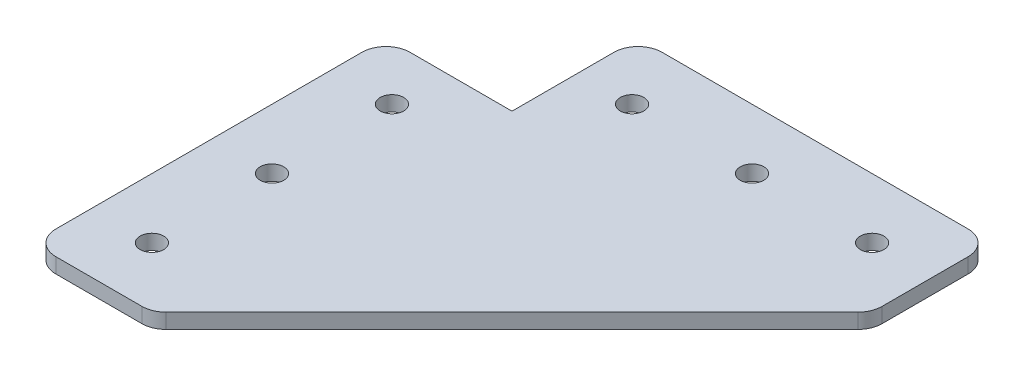
ISO-10303-21;
HEADER;
FILE_DESCRIPTION(('STEP AP214'),'2;1');
FILE_NAME('part.step','',(''),(''),'','','');
FILE_SCHEMA(('AUTOMOTIVE_DESIGN { 1 0 10303 214 1 1 1 1 }'));
ENDSEC;
DATA;
#1=APPLICATION_CONTEXT('core data for automotive mechanical design processes');
#2=APPLICATION_PROTOCOL_DEFINITION('international standard','automotive_design',2000,#1);
#3=PRODUCT_CONTEXT('',#1,'mechanical');
#4=PRODUCT('Part','Part','',(#3));
#5=PRODUCT_RELATED_PRODUCT_CATEGORY('part','',(#4));
#6=PRODUCT_DEFINITION_FORMATION('','',#4);
#7=PRODUCT_DEFINITION_CONTEXT('part definition',#1,'design');
#8=PRODUCT_DEFINITION('design','',#6,#7);
#9=PRODUCT_DEFINITION_SHAPE('','',#8);
#10=(LENGTH_UNIT() NAMED_UNIT(*) SI_UNIT(.MILLI.,.METRE.));
#11=(NAMED_UNIT(*) PLANE_ANGLE_UNIT() SI_UNIT($,.RADIAN.));
#12=(NAMED_UNIT(*) SI_UNIT($,.STERADIAN.) SOLID_ANGLE_UNIT());
#13=UNCERTAINTY_MEASURE_WITH_UNIT(LENGTH_MEASURE(1.E-05),#10,'distance_accuracy_value','');
#14=(GEOMETRIC_REPRESENTATION_CONTEXT(3) GLOBAL_UNCERTAINTY_ASSIGNED_CONTEXT((#13)) GLOBAL_UNIT_ASSIGNED_CONTEXT((#10,
#11,#12)) REPRESENTATION_CONTEXT('',''));
#15=CARTESIAN_POINT('',(0.,0.,0.));
#16=DIRECTION('',(0.,0.,1.));
#17=DIRECTION('',(1.,0.,0.));
#18=AXIS2_PLACEMENT_3D('',#15,#16,#17);
#19=CARTESIAN_POINT('',(0.,3.175,0.));
#20=DIRECTION('',(0.,0.,-1.));
#21=DIRECTION('',(-1.,0.,0.));
#22=AXIS2_PLACEMENT_3D('',#19,#20,#21);
#23=PLANE('',#22);
#24=DIRECTION('',(1.,0.,0.));
#25=VECTOR('',#24,1.);
#26=CARTESIAN_POINT('',(0.,3.175,0.));
#27=LINE('',#26,#25);
#28=CARTESIAN_POINT('',(5.08,3.175,0.));
#29=VERTEX_POINT('',#28);
#30=CARTESIAN_POINT('',(23.2957951031447,3.175,0.));
#31=VERTEX_POINT('',#30);
#32=EDGE_CURVE('E215',#29,#31,#27,.T.);
#33=ORIENTED_EDGE('',*,*,#32,.F.);
#34=DIRECTION('',(0.,-1.,0.));
#35=VECTOR('',#34,1.);
#36=CARTESIAN_POINT('',(5.08,3.175,0.));
#37=LINE('',#36,#35);
#38=CARTESIAN_POINT('',(5.08,0.,0.));
#39=VERTEX_POINT('',#38);
#40=EDGE_CURVE('E254',#29,#39,#37,.T.);
#41=ORIENTED_EDGE('',*,*,#40,.T.);
#42=DIRECTION('',(1.,0.,0.));
#43=VECTOR('',#42,1.);
#44=CARTESIAN_POINT('',(0.,0.,0.));
#45=LINE('',#44,#43);
#46=CARTESIAN_POINT('',(23.2957951031447,0.,0.));
#47=VERTEX_POINT('',#46);
#48=EDGE_CURVE('E189',#39,#47,#45,.T.);
#49=ORIENTED_EDGE('',*,*,#48,.T.);
#50=DIRECTION('',(0.,-1.,0.));
#51=VECTOR('',#50,1.);
#52=CARTESIAN_POINT('',(23.2957951031447,3.175,0.));
#53=LINE('',#52,#51);
#54=EDGE_CURVE('E233',#47,#31,#53,.F.);
#55=ORIENTED_EDGE('',*,*,#54,.T.);
#56=EDGE_LOOP('',(#33,#41,#49,#55));
#57=FACE_BOUND('',#56,.T.);
#58=ADVANCED_FACE('F39',(#57),#23,.F.);
#59=CARTESIAN_POINT('',(25.4,3.175,0.));
#60=DIRECTION('',(-0.707106781186548,0.,-0.707106781186548));
#61=DIRECTION('',(-0.707106781186548,0.,0.707106781186548));
#62=AXIS2_PLACEMENT_3D('',#59,#60,#61);
#63=PLANE('',#62);
#64=DIRECTION('',(0.707106781186548,0.,-0.707106781186548));
#65=VECTOR('',#64,1.);
#66=CARTESIAN_POINT('',(25.4,3.175,0.));
#67=LINE('',#66,#65);
#68=CARTESIAN_POINT('',(26.8878975515723,3.175,-1.48789755157234));
#69=VERTEX_POINT('',#68);
#70=CARTESIAN_POINT('',(100.112102448428,3.175,-74.7121024484277));
#71=VERTEX_POINT('',#70);
#72=EDGE_CURVE('E219',#69,#71,#67,.T.);
#73=ORIENTED_EDGE('',*,*,#72,.F.);
#74=DIRECTION('',(0.,-1.,0.));
#75=VECTOR('',#74,1.);
#76=CARTESIAN_POINT('',(26.8878975515723,3.175,-1.48789755157234));
#77=LINE('',#76,#75);
#78=CARTESIAN_POINT('',(26.8878975515723,0.,-1.48789755157234));
#79=VERTEX_POINT('',#78);
#80=EDGE_CURVE('E301',#69,#79,#77,.T.);
#81=ORIENTED_EDGE('',*,*,#80,.T.);
#82=DIRECTION('',(0.707106781186548,0.,-0.707106781186548));
#83=VECTOR('',#82,1.);
#84=CARTESIAN_POINT('',(25.4,0.,0.));
#85=LINE('',#84,#83);
#86=CARTESIAN_POINT('',(100.112102448428,0.,-74.7121024484277));
#87=VERTEX_POINT('',#86);
#88=EDGE_CURVE('E237',#79,#87,#85,.T.);
#89=ORIENTED_EDGE('',*,*,#88,.T.);
#90=DIRECTION('',(0.,-1.,0.));
#91=VECTOR('',#90,1.);
#92=CARTESIAN_POINT('',(100.112102448428,3.175,-74.7121024484276));
#93=LINE('',#92,#91);
#94=EDGE_CURVE('E298',#87,#71,#93,.F.);
#95=ORIENTED_EDGE('',*,*,#94,.T.);
#96=EDGE_LOOP('',(#73,#81,#89,#95));
#97=FACE_BOUND('',#96,.T.);
#98=ADVANCED_FACE('F348',(#97),#63,.F.);
#99=CARTESIAN_POINT('',(101.6,3.175,-76.2));
#100=DIRECTION('',(-1.,0.,0.));
#101=DIRECTION('',(0.,0.,1.));
#102=AXIS2_PLACEMENT_3D('',#99,#100,#101);
#103=PLANE('',#102);
#104=DIRECTION('',(0.,0.,-1.));
#105=VECTOR('',#104,1.);
#106=CARTESIAN_POINT('',(101.6,3.175,-76.2));
#107=LINE('',#106,#105);
#108=CARTESIAN_POINT('',(101.6,3.175,-78.3042048968553));
#109=VERTEX_POINT('',#108);
#110=CARTESIAN_POINT('',(101.6,3.175,-96.52));
#111=VERTEX_POINT('',#110);
#112=EDGE_CURVE('E224',#109,#111,#107,.T.);
#113=ORIENTED_EDGE('',*,*,#112,.F.);
#114=DIRECTION('',(0.,-1.,0.));
#115=VECTOR('',#114,1.);
#116=CARTESIAN_POINT('',(101.6,3.175,-78.3042048968553));
#117=LINE('',#116,#115);
#118=CARTESIAN_POINT('',(101.6,0.,-78.3042048968553));
#119=VERTEX_POINT('',#118);
#120=EDGE_CURVE('E308',#109,#119,#117,.T.);
#121=ORIENTED_EDGE('',*,*,#120,.T.);
#122=DIRECTION('',(0.,0.,-1.));
#123=VECTOR('',#122,1.);
#124=CARTESIAN_POINT('',(101.6,0.,-76.2));
#125=LINE('',#124,#123);
#126=CARTESIAN_POINT('',(101.6,0.,-96.52));
#127=VERTEX_POINT('',#126);
#128=EDGE_CURVE('E241',#119,#127,#125,.T.);
#129=ORIENTED_EDGE('',*,*,#128,.T.);
#130=DIRECTION('',(0.,-1.,0.));
#131=VECTOR('',#130,1.);
#132=CARTESIAN_POINT('',(101.6,3.175,-96.52));
#133=LINE('',#132,#131);
#134=EDGE_CURVE('E305',#127,#111,#133,.F.);
#135=ORIENTED_EDGE('',*,*,#134,.T.);
#136=EDGE_LOOP('',(#113,#121,#129,#135));
#137=FACE_BOUND('',#136,.T.);
#138=ADVANCED_FACE('F334',(#137),#103,.F.);
#139=CARTESIAN_POINT('',(0.,3.175,-101.6));
#140=DIRECTION('',(0.,0.,1.));
#141=DIRECTION('',(1.,0.,0.));
#142=AXIS2_PLACEMENT_3D('',#139,#140,#141);
#143=PLANE('',#142);
#144=DIRECTION('',(-1.,0.,0.));
#145=VECTOR('',#144,1.);
#146=CARTESIAN_POINT('',(0.,3.175,-101.6));
#147=LINE('',#146,#145);
#148=CARTESIAN_POINT('',(96.52,3.175,-101.6));
#149=VERTEX_POINT('',#148);
#150=CARTESIAN_POINT('',(31.75,3.175,-101.6));
#151=VERTEX_POINT('',#150);
#152=EDGE_CURVE('E227',#149,#151,#147,.T.);
#153=ORIENTED_EDGE('',*,*,#152,.F.);
#154=DIRECTION('',(0.,-1.,0.));
#155=VECTOR('',#154,1.);
#156=CARTESIAN_POINT('',(96.52,3.175,-101.6));
#157=LINE('',#156,#155);
#158=CARTESIAN_POINT('',(96.52,0.,-101.6));
#159=VERTEX_POINT('',#158);
#160=EDGE_CURVE('E315',#149,#159,#157,.T.);
#161=ORIENTED_EDGE('',*,*,#160,.T.);
#162=DIRECTION('',(-1.,0.,0.));
#163=VECTOR('',#162,1.);
#164=CARTESIAN_POINT('',(0.,0.,-101.6));
#165=LINE('',#164,#163);
#166=CARTESIAN_POINT('',(31.75,0.,-101.6));
#167=VERTEX_POINT('',#166);
#168=EDGE_CURVE('E245',#159,#167,#165,.T.);
#169=ORIENTED_EDGE('',*,*,#168,.T.);
#170=DIRECTION('',(0.,1.,0.));
#171=VECTOR('',#170,1.);
#172=CARTESIAN_POINT('',(31.75,3.175,-101.6));
#173=LINE('',#172,#171);
#174=EDGE_CURVE('E312',#167,#151,#173,.T.);
#175=ORIENTED_EDGE('',*,*,#174,.T.);
#176=EDGE_LOOP('',(#153,#161,#169,#175));
#177=FACE_BOUND('',#176,.T.);
#178=ADVANCED_FACE('F327',(#177),#143,.F.);
#179=CARTESIAN_POINT('',(0.,3.175,0.));
#180=DIRECTION('',(1.,0.,0.));
#181=DIRECTION('',(0.,0.,-1.));
#182=AXIS2_PLACEMENT_3D('',#179,#180,#181);
#183=PLANE('',#182);
#184=DIRECTION('',(0.,0.,1.));
#185=VECTOR('',#184,1.);
#186=CARTESIAN_POINT('',(0.,0.,0.));
#187=LINE('',#186,#185);
#188=CARTESIAN_POINT('',(0.,0.,-69.85));
#189=VERTEX_POINT('',#188);
#190=CARTESIAN_POINT('',(0.,0.,-5.08));
#191=VERTEX_POINT('',#190);
#192=EDGE_CURVE('E220',#189,#191,#187,.T.);
#193=ORIENTED_EDGE('',*,*,#192,.T.);
#194=DIRECTION('',(0.,-1.,0.));
#195=VECTOR('',#194,1.);
#196=CARTESIAN_POINT('',(0.,3.175,-5.08));
#197=LINE('',#196,#195);
#198=CARTESIAN_POINT('',(0.,3.175,-5.08));
#199=VERTEX_POINT('',#198);
#200=EDGE_CURVE('E279',#191,#199,#197,.F.);
#201=ORIENTED_EDGE('',*,*,#200,.T.);
#202=DIRECTION('',(0.,0.,1.));
#203=VECTOR('',#202,1.);
#204=CARTESIAN_POINT('',(0.,3.175,0.));
#205=LINE('',#204,#203);
#206=CARTESIAN_POINT('',(0.,3.175,-69.85));
#207=VERTEX_POINT('',#206);
#208=EDGE_CURVE('E230',#207,#199,#205,.T.);
#209=ORIENTED_EDGE('',*,*,#208,.F.);
#210=DIRECTION('',(0.,1.,0.));
#211=VECTOR('',#210,1.);
#212=CARTESIAN_POINT('',(0.,3.175,-69.85));
#213=LINE('',#212,#211);
#214=EDGE_CURVE('E276',#207,#189,#213,.F.);
#215=ORIENTED_EDGE('',*,*,#214,.T.);
#216=EDGE_LOOP('',(#193,#201,#209,#215));
#217=FACE_BOUND('',#216,.T.);
#218=ADVANCED_FACE('F380',(#217),#183,.F.);
#219=CARTESIAN_POINT('',(0.,3.175,0.));
#220=DIRECTION('',(0.,1.,0.));
#221=DIRECTION('',(0.,0.,1.));
#222=AXIS2_PLACEMENT_3D('',#219,#220,#221);
#223=PLANE('',#222);
#224=ORIENTED_EDGE('',*,*,#208,.T.);
#225=CARTESIAN_POINT('',(5.08,3.175,-5.08));
#226=DIRECTION('',(0.,1.,0.));
#227=DIRECTION('',(0.,0.,1.));
#228=AXIS2_PLACEMENT_3D('',#225,#226,#227);
#229=CIRCLE('',#228,5.08);
#230=EDGE_CURVE('E295',#199,#29,#229,.T.);
#231=ORIENTED_EDGE('',*,*,#230,.T.);
#232=ORIENTED_EDGE('',*,*,#32,.T.);
#233=CARTESIAN_POINT('',(23.2957951031447,3.175,-5.08));
#234=DIRECTION('',(0.,1.,0.));
#235=DIRECTION('',(0.,0.,1.));
#236=AXIS2_PLACEMENT_3D('',#233,#234,#235);
#237=CIRCLE('',#236,5.08);
#238=EDGE_CURVE('E292',#31,#69,#237,.T.);
#239=ORIENTED_EDGE('',*,*,#238,.T.);
#240=ORIENTED_EDGE('',*,*,#72,.T.);
#241=CARTESIAN_POINT('',(96.52,3.175,-78.3042048968553));
#242=DIRECTION('',(0.,1.,0.));
#243=DIRECTION('',(0.,0.,1.));
#244=AXIS2_PLACEMENT_3D('',#241,#242,#243);
#245=CIRCLE('',#244,5.08);
#246=EDGE_CURVE('E289',#71,#109,#245,.T.);
#247=ORIENTED_EDGE('',*,*,#246,.T.);
#248=ORIENTED_EDGE('',*,*,#112,.T.);
#249=CARTESIAN_POINT('',(96.52,3.175,-96.52));
#250=DIRECTION('',(0.,1.,0.));
#251=DIRECTION('',(0.,0.,1.));
#252=AXIS2_PLACEMENT_3D('',#249,#250,#251);
#253=CIRCLE('',#252,5.08);
#254=EDGE_CURVE('E63',#111,#149,#253,.T.);
#255=ORIENTED_EDGE('',*,*,#254,.T.);
#256=ORIENTED_EDGE('',*,*,#152,.T.);
#257=CARTESIAN_POINT('',(31.75,3.175,-96.52));
#258=DIRECTION('',(0.,1.,0.));
#259=DIRECTION('',(0.,0.,1.));
#260=AXIS2_PLACEMENT_3D('',#257,#258,#259);
#261=CIRCLE('',#260,5.08);
#262=CARTESIAN_POINT('',(26.67,3.175,-96.52));
#263=VERTEX_POINT('',#262);
#264=EDGE_CURVE('E55',#151,#263,#261,.T.);
#265=ORIENTED_EDGE('',*,*,#264,.T.);
#266=DIRECTION('',(0.,0.,-1.));
#267=VECTOR('',#266,1.);
#268=CARTESIAN_POINT('',(26.67,3.175,-101.6));
#269=LINE('',#268,#267);
#270=CARTESIAN_POINT('',(26.67,3.175,-74.93));
#271=VERTEX_POINT('',#270);
#272=EDGE_CURVE('E146',#271,#263,#269,.T.);
#273=ORIENTED_EDGE('',*,*,#272,.F.);
#274=DIRECTION('',(1.,0.,0.));
#275=VECTOR('',#274,1.);
#276=CARTESIAN_POINT('',(0.,3.175,-74.93));
#277=LINE('',#276,#275);
#278=CARTESIAN_POINT('',(5.08,3.175,-74.93));
#279=VERTEX_POINT('',#278);
#280=EDGE_CURVE('E138',#279,#271,#277,.T.);
#281=ORIENTED_EDGE('',*,*,#280,.F.);
#282=CARTESIAN_POINT('',(5.08,3.175,-69.85));
#283=DIRECTION('',(0.,1.,0.));
#284=DIRECTION('',(0.,0.,1.));
#285=AXIS2_PLACEMENT_3D('',#282,#283,#284);
#286=CIRCLE('',#285,5.08);
#287=EDGE_CURVE('E282',#279,#207,#286,.T.);
#288=ORIENTED_EDGE('',*,*,#287,.T.);
#289=EDGE_LOOP('',(#224,#231,#232,#239,#240,#247,#248,#255,#256,#265,#273,#281,#288));
#290=FACE_BOUND('',#289,.T.);
#291=CARTESIAN_POINT('',(12.7,3.175,-12.7));
#292=DIRECTION('',(0.,1.,0.));
#293=DIRECTION('',(0.,0.,1.));
#294=AXIS2_PLACEMENT_3D('',#291,#292,#293);
#295=CIRCLE('',#294,2.4892);
#296=CARTESIAN_POINT('',(12.7,3.175,-10.2108));
#297=VERTEX_POINT('',#296);
#298=EDGE_CURVE('E155',#297,#297,#295,.T.);
#299=ORIENTED_EDGE('',*,*,#298,.F.);
#300=EDGE_LOOP('',(#299));
#301=FACE_BOUND('',#300,.T.);
#302=CARTESIAN_POINT('',(12.7,3.175,-38.1));
#303=DIRECTION('',(0.,1.,0.));
#304=DIRECTION('',(0.,0.,1.));
#305=AXIS2_PLACEMENT_3D('',#302,#303,#304);
#306=CIRCLE('',#305,2.4892);
#307=CARTESIAN_POINT('',(12.7,3.175,-35.6108));
#308=VERTEX_POINT('',#307);
#309=EDGE_CURVE('E204',#308,#308,#306,.T.);
#310=ORIENTED_EDGE('',*,*,#309,.F.);
#311=EDGE_LOOP('',(#310));
#312=FACE_BOUND('',#311,.T.);
#313=CARTESIAN_POINT('',(38.1,3.175,-88.9));
#314=DIRECTION('',(0.,1.,0.));
#315=DIRECTION('',(0.,0.,1.));
#316=AXIS2_PLACEMENT_3D('',#313,#314,#315);
#317=CIRCLE('',#316,2.4892);
#318=CARTESIAN_POINT('',(38.1,3.175,-86.4108));
#319=VERTEX_POINT('',#318);
#320=EDGE_CURVE('E190',#319,#319,#317,.T.);
#321=ORIENTED_EDGE('',*,*,#320,.F.);
#322=EDGE_LOOP('',(#321));
#323=FACE_BOUND('',#322,.T.);
#324=CARTESIAN_POINT('',(63.5,3.175,-88.9));
#325=DIRECTION('',(0.,1.,0.));
#326=DIRECTION('',(0.,0.,1.));
#327=AXIS2_PLACEMENT_3D('',#324,#325,#326);
#328=CIRCLE('',#327,2.4892);
#329=CARTESIAN_POINT('',(63.5,3.175,-86.4108));
#330=VERTEX_POINT('',#329);
#331=EDGE_CURVE('E171',#330,#330,#328,.T.);
#332=ORIENTED_EDGE('',*,*,#331,.F.);
#333=EDGE_LOOP('',(#332));
#334=FACE_BOUND('',#333,.T.);
#335=CARTESIAN_POINT('',(88.9,3.175,-88.9));
#336=DIRECTION('',(0.,1.,0.));
#337=DIRECTION('',(0.,0.,1.));
#338=AXIS2_PLACEMENT_3D('',#335,#336,#337);
#339=CIRCLE('',#338,2.4892);
#340=CARTESIAN_POINT('',(88.9,3.175,-86.4108));
#341=VERTEX_POINT('',#340);
#342=EDGE_CURVE('E172',#341,#341,#339,.T.);
#343=ORIENTED_EDGE('',*,*,#342,.F.);
#344=EDGE_LOOP('',(#343));
#345=FACE_BOUND('',#344,.T.);
#346=CARTESIAN_POINT('',(12.7,3.175,-63.5));
#347=DIRECTION('',(0.,1.,0.));
#348=DIRECTION('',(0.,0.,1.));
#349=AXIS2_PLACEMENT_3D('',#346,#347,#348);
#350=CIRCLE('',#349,2.4892);
#351=CARTESIAN_POINT('',(12.7,3.175,-61.0108));
#352=VERTEX_POINT('',#351);
#353=EDGE_CURVE('E180',#352,#352,#350,.T.);
#354=ORIENTED_EDGE('',*,*,#353,.F.);
#355=EDGE_LOOP('',(#354));
#356=FACE_BOUND('',#355,.T.);
#357=ADVANCED_FACE('F158',(#290,#301,#312,#323,#334,#345,#356),#223,.T.);
#358=CARTESIAN_POINT('',(0.,0.,0.));
#359=DIRECTION('',(0.,1.,0.));
#360=DIRECTION('',(0.,0.,1.));
#361=AXIS2_PLACEMENT_3D('',#358,#359,#360);
#362=PLANE('',#361);
#363=CARTESIAN_POINT('',(12.7,0.,-12.7));
#364=DIRECTION('',(0.,1.,0.));
#365=DIRECTION('',(0.,0.,1.));
#366=AXIS2_PLACEMENT_3D('',#363,#364,#365);
#367=CIRCLE('',#366,2.4892);
#368=CARTESIAN_POINT('',(12.7,0.,-10.2108));
#369=VERTEX_POINT('',#368);
#370=EDGE_CURVE('E208',#369,#369,#367,.T.);
#371=ORIENTED_EDGE('',*,*,#370,.T.);
#372=EDGE_LOOP('',(#371));
#373=FACE_BOUND('',#372,.T.);
#374=CARTESIAN_POINT('',(12.7,0.,-38.1));
#375=DIRECTION('',(0.,1.,0.));
#376=DIRECTION('',(0.,0.,1.));
#377=AXIS2_PLACEMENT_3D('',#374,#375,#376);
#378=CIRCLE('',#377,2.4892);
#379=CARTESIAN_POINT('',(12.7,0.,-35.6108));
#380=VERTEX_POINT('',#379);
#381=EDGE_CURVE('E184',#380,#380,#378,.T.);
#382=ORIENTED_EDGE('',*,*,#381,.T.);
#383=EDGE_LOOP('',(#382));
#384=FACE_BOUND('',#383,.T.);
#385=CARTESIAN_POINT('',(38.1,0.,-88.9));
#386=DIRECTION('',(0.,1.,0.));
#387=DIRECTION('',(0.,0.,1.));
#388=AXIS2_PLACEMENT_3D('',#385,#386,#387);
#389=CIRCLE('',#388,2.4892);
#390=CARTESIAN_POINT('',(38.1,0.,-86.4108));
#391=VERTEX_POINT('',#390);
#392=EDGE_CURVE('E185',#391,#391,#389,.T.);
#393=ORIENTED_EDGE('',*,*,#392,.T.);
#394=EDGE_LOOP('',(#393));
#395=FACE_BOUND('',#394,.T.);
#396=CARTESIAN_POINT('',(63.5,0.,-88.9));
#397=DIRECTION('',(0.,1.,0.));
#398=DIRECTION('',(0.,0.,1.));
#399=AXIS2_PLACEMENT_3D('',#396,#397,#398);
#400=CIRCLE('',#399,2.4892);
#401=CARTESIAN_POINT('',(63.5,0.,-86.4108));
#402=VERTEX_POINT('',#401);
#403=EDGE_CURVE('E194',#402,#402,#400,.T.);
#404=ORIENTED_EDGE('',*,*,#403,.T.);
#405=EDGE_LOOP('',(#404));
#406=FACE_BOUND('',#405,.T.);
#407=CARTESIAN_POINT('',(88.9,0.,-88.9));
#408=DIRECTION('',(0.,1.,0.));
#409=DIRECTION('',(0.,0.,1.));
#410=AXIS2_PLACEMENT_3D('',#407,#408,#409);
#411=CIRCLE('',#410,2.4892);
#412=CARTESIAN_POINT('',(88.9,0.,-86.4108));
#413=VERTEX_POINT('',#412);
#414=EDGE_CURVE('E167',#413,#413,#411,.T.);
#415=ORIENTED_EDGE('',*,*,#414,.T.);
#416=EDGE_LOOP('',(#415));
#417=FACE_BOUND('',#416,.T.);
#418=CARTESIAN_POINT('',(12.7,0.,-63.5));
#419=DIRECTION('',(0.,1.,0.));
#420=DIRECTION('',(0.,0.,1.));
#421=AXIS2_PLACEMENT_3D('',#418,#419,#420);
#422=CIRCLE('',#421,2.4892);
#423=CARTESIAN_POINT('',(12.7,0.,-61.0108));
#424=VERTEX_POINT('',#423);
#425=EDGE_CURVE('E176',#424,#424,#422,.T.);
#426=ORIENTED_EDGE('',*,*,#425,.T.);
#427=EDGE_LOOP('',(#426));
#428=FACE_BOUND('',#427,.T.);
#429=ORIENTED_EDGE('',*,*,#48,.F.);
#430=CARTESIAN_POINT('',(5.08,0.,-5.08));
#431=DIRECTION('',(0.,1.,0.));
#432=DIRECTION('',(0.,0.,1.));
#433=AXIS2_PLACEMENT_3D('',#430,#431,#432);
#434=CIRCLE('',#433,5.08);
#435=EDGE_CURVE('E273',#39,#191,#434,.F.);
#436=ORIENTED_EDGE('',*,*,#435,.T.);
#437=ORIENTED_EDGE('',*,*,#192,.F.);
#438=CARTESIAN_POINT('',(5.08,0.,-69.85));
#439=DIRECTION('',(0.,1.,0.));
#440=DIRECTION('',(0.,0.,1.));
#441=AXIS2_PLACEMENT_3D('',#438,#439,#440);
#442=CIRCLE('',#441,5.08);
#443=CARTESIAN_POINT('',(5.08,0.,-74.93));
#444=VERTEX_POINT('',#443);
#445=EDGE_CURVE('E258',#189,#444,#442,.F.);
#446=ORIENTED_EDGE('',*,*,#445,.T.);
#447=DIRECTION('',(1.,0.,0.));
#448=VECTOR('',#447,1.);
#449=CARTESIAN_POINT('',(0.,0.,-74.93));
#450=LINE('',#449,#448);
#451=CARTESIAN_POINT('',(26.67,0.,-74.93));
#452=VERTEX_POINT('',#451);
#453=EDGE_CURVE('E161',#444,#452,#450,.T.);
#454=ORIENTED_EDGE('',*,*,#453,.T.);
#455=DIRECTION('',(0.,0.,-1.));
#456=VECTOR('',#455,1.);
#457=CARTESIAN_POINT('',(26.67,0.,-101.6));
#458=LINE('',#457,#456);
#459=CARTESIAN_POINT('',(26.67,0.,-96.52));
#460=VERTEX_POINT('',#459);
#461=EDGE_CURVE('E153',#452,#460,#458,.T.);
#462=ORIENTED_EDGE('',*,*,#461,.T.);
#463=CARTESIAN_POINT('',(31.75,0.,-96.52));
#464=DIRECTION('',(0.,1.,0.));
#465=DIRECTION('',(0.,0.,1.));
#466=AXIS2_PLACEMENT_3D('',#463,#464,#465);
#467=CIRCLE('',#466,5.08);
#468=EDGE_CURVE('E261',#460,#167,#467,.F.);
#469=ORIENTED_EDGE('',*,*,#468,.T.);
#470=ORIENTED_EDGE('',*,*,#168,.F.);
#471=CARTESIAN_POINT('',(96.52,0.,-96.52));
#472=DIRECTION('',(0.,1.,0.));
#473=DIRECTION('',(0.,0.,1.));
#474=AXIS2_PLACEMENT_3D('',#471,#472,#473);
#475=CIRCLE('',#474,5.08);
#476=EDGE_CURVE('E264',#159,#127,#475,.F.);
#477=ORIENTED_EDGE('',*,*,#476,.T.);
#478=ORIENTED_EDGE('',*,*,#128,.F.);
#479=CARTESIAN_POINT('',(96.52,0.,-78.3042048968553));
#480=DIRECTION('',(0.,1.,0.));
#481=DIRECTION('',(0.,0.,1.));
#482=AXIS2_PLACEMENT_3D('',#479,#480,#481);
#483=CIRCLE('',#482,5.08);
#484=EDGE_CURVE('E267',#119,#87,#483,.F.);
#485=ORIENTED_EDGE('',*,*,#484,.T.);
#486=ORIENTED_EDGE('',*,*,#88,.F.);
#487=CARTESIAN_POINT('',(23.2957951031447,0.,-5.08));
#488=DIRECTION('',(0.,1.,0.));
#489=DIRECTION('',(0.,0.,1.));
#490=AXIS2_PLACEMENT_3D('',#487,#488,#489);
#491=CIRCLE('',#490,5.08);
#492=EDGE_CURVE('E270',#79,#47,#491,.F.);
#493=ORIENTED_EDGE('',*,*,#492,.T.);
#494=EDGE_LOOP('',(#429,#436,#437,#446,#454,#462,#469,#470,#477,#478,#485,#486,#493));
#495=FACE_BOUND('',#494,.T.);
#496=ADVANCED_FACE('F322',(#373,#384,#395,#406,#417,#428,#495),#362,.F.);
#497=CARTESIAN_POINT('',(12.7,0.,-63.5));
#498=DIRECTION('',(0.,1.,0.));
#499=DIRECTION('',(0.,0.,1.));
#500=AXIS2_PLACEMENT_3D('',#497,#498,#499);
#501=CYLINDRICAL_SURFACE('',#500,2.4892);
#502=ORIENTED_EDGE('',*,*,#425,.F.);
#503=EDGE_LOOP('',(#502));
#504=FACE_BOUND('',#503,.T.);
#505=ORIENTED_EDGE('',*,*,#353,.T.);
#506=EDGE_LOOP('',(#505));
#507=FACE_BOUND('',#506,.T.);
#508=ADVANCED_FACE('F439',(#504,#507),#501,.F.);
#509=CARTESIAN_POINT('',(88.9,0.,-88.9));
#510=DIRECTION('',(0.,1.,0.));
#511=DIRECTION('',(0.,0.,1.));
#512=AXIS2_PLACEMENT_3D('',#509,#510,#511);
#513=CYLINDRICAL_SURFACE('',#512,2.4892);
#514=ORIENTED_EDGE('',*,*,#414,.F.);
#515=EDGE_LOOP('',(#514));
#516=FACE_BOUND('',#515,.T.);
#517=ORIENTED_EDGE('',*,*,#342,.T.);
#518=EDGE_LOOP('',(#517));
#519=FACE_BOUND('',#518,.T.);
#520=ADVANCED_FACE('F520',(#516,#519),#513,.F.);
#521=CARTESIAN_POINT('',(63.5,0.,-88.9));
#522=DIRECTION('',(0.,1.,0.));
#523=DIRECTION('',(0.,0.,1.));
#524=AXIS2_PLACEMENT_3D('',#521,#522,#523);
#525=CYLINDRICAL_SURFACE('',#524,2.4892);
#526=ORIENTED_EDGE('',*,*,#403,.F.);
#527=EDGE_LOOP('',(#526));
#528=FACE_BOUND('',#527,.T.);
#529=ORIENTED_EDGE('',*,*,#331,.T.);
#530=EDGE_LOOP('',(#529));
#531=FACE_BOUND('',#530,.T.);
#532=ADVANCED_FACE('F510',(#528,#531),#525,.F.);
#533=CARTESIAN_POINT('',(38.1,0.,-88.9));
#534=DIRECTION('',(0.,1.,0.));
#535=DIRECTION('',(0.,0.,1.));
#536=AXIS2_PLACEMENT_3D('',#533,#534,#535);
#537=CYLINDRICAL_SURFACE('',#536,2.4892);
#538=ORIENTED_EDGE('',*,*,#392,.F.);
#539=EDGE_LOOP('',(#538));
#540=FACE_BOUND('',#539,.T.);
#541=ORIENTED_EDGE('',*,*,#320,.T.);
#542=EDGE_LOOP('',(#541));
#543=FACE_BOUND('',#542,.T.);
#544=ADVANCED_FACE('F500',(#540,#543),#537,.F.);
#545=CARTESIAN_POINT('',(12.7,0.,-38.1));
#546=DIRECTION('',(0.,1.,0.));
#547=DIRECTION('',(0.,0.,1.));
#548=AXIS2_PLACEMENT_3D('',#545,#546,#547);
#549=CYLINDRICAL_SURFACE('',#548,2.4892);
#550=ORIENTED_EDGE('',*,*,#381,.F.);
#551=EDGE_LOOP('',(#550));
#552=FACE_BOUND('',#551,.T.);
#553=ORIENTED_EDGE('',*,*,#309,.T.);
#554=EDGE_LOOP('',(#553));
#555=FACE_BOUND('',#554,.T.);
#556=ADVANCED_FACE('F490',(#552,#555),#549,.F.);
#557=CARTESIAN_POINT('',(12.7,0.,-12.7));
#558=DIRECTION('',(0.,1.,0.));
#559=DIRECTION('',(0.,0.,1.));
#560=AXIS2_PLACEMENT_3D('',#557,#558,#559);
#561=CYLINDRICAL_SURFACE('',#560,2.4892);
#562=ORIENTED_EDGE('',*,*,#370,.F.);
#563=EDGE_LOOP('',(#562));
#564=FACE_BOUND('',#563,.T.);
#565=ORIENTED_EDGE('',*,*,#298,.T.);
#566=EDGE_LOOP('',(#565));
#567=FACE_BOUND('',#566,.T.);
#568=ADVANCED_FACE('F428',(#564,#567),#561,.F.);
#569=CARTESIAN_POINT('',(26.67,0.,-101.6));
#570=DIRECTION('',(1.,0.,0.));
#571=DIRECTION('',(0.,0.,-1.));
#572=AXIS2_PLACEMENT_3D('',#569,#570,#571);
#573=PLANE('',#572);
#574=ORIENTED_EDGE('',*,*,#272,.T.);
#575=DIRECTION('',(0.,1.,0.));
#576=VECTOR('',#575,1.);
#577=CARTESIAN_POINT('',(26.67,0.,-96.52));
#578=LINE('',#577,#576);
#579=EDGE_CURVE('E48',#263,#460,#578,.F.);
#580=ORIENTED_EDGE('',*,*,#579,.T.);
#581=ORIENTED_EDGE('',*,*,#461,.F.);
#582=DIRECTION('',(0.,1.,0.));
#583=VECTOR('',#582,1.);
#584=CARTESIAN_POINT('',(26.67,0.,-74.93));
#585=LINE('',#584,#583);
#586=EDGE_CURVE('E142',#452,#271,#585,.T.);
#587=ORIENTED_EDGE('',*,*,#586,.T.);
#588=EDGE_LOOP('',(#574,#580,#581,#587));
#589=FACE_BOUND('',#588,.T.);
#590=ADVANCED_FACE('F151',(#589),#573,.F.);
#591=CARTESIAN_POINT('',(0.,0.,-74.93));
#592=DIRECTION('',(0.,0.,1.));
#593=DIRECTION('',(1.,0.,0.));
#594=AXIS2_PLACEMENT_3D('',#591,#592,#593);
#595=PLANE('',#594);
#596=ORIENTED_EDGE('',*,*,#453,.F.);
#597=DIRECTION('',(0.,1.,0.));
#598=VECTOR('',#597,1.);
#599=CARTESIAN_POINT('',(5.08,0.,-74.93));
#600=LINE('',#599,#598);
#601=EDGE_CURVE('E11',#444,#279,#600,.T.);
#602=ORIENTED_EDGE('',*,*,#601,.T.);
#603=ORIENTED_EDGE('',*,*,#280,.T.);
#604=ORIENTED_EDGE('',*,*,#586,.F.);
#605=EDGE_LOOP('',(#596,#602,#603,#604));
#606=FACE_BOUND('',#605,.T.);
#607=ADVANCED_FACE('F141',(#606),#595,.F.);
#608=CARTESIAN_POINT('',(5.08,3.175,-5.08));
#609=DIRECTION('',(0.,-1.,0.));
#610=DIRECTION('',(0.,0.,-1.));
#611=AXIS2_PLACEMENT_3D('',#608,#609,#610);
#612=CYLINDRICAL_SURFACE('',#611,5.08);
#613=ORIENTED_EDGE('',*,*,#230,.F.);
#614=ORIENTED_EDGE('',*,*,#200,.F.);
#615=ORIENTED_EDGE('',*,*,#435,.F.);
#616=ORIENTED_EDGE('',*,*,#40,.F.);
#617=EDGE_LOOP('',(#613,#614,#615,#616));
#618=FACE_BOUND('',#617,.T.);
#619=ADVANCED_FACE('F359',(#618),#612,.T.);
#620=CARTESIAN_POINT('',(23.2957951031447,3.175,-5.08));
#621=DIRECTION('',(0.,-1.,0.));
#622=DIRECTION('',(0.,0.,-1.));
#623=AXIS2_PLACEMENT_3D('',#620,#621,#622);
#624=CYLINDRICAL_SURFACE('',#623,5.08);
#625=ORIENTED_EDGE('',*,*,#238,.F.);
#626=ORIENTED_EDGE('',*,*,#54,.F.);
#627=ORIENTED_EDGE('',*,*,#492,.F.);
#628=ORIENTED_EDGE('',*,*,#80,.F.);
#629=EDGE_LOOP('',(#625,#626,#627,#628));
#630=FACE_BOUND('',#629,.T.);
#631=ADVANCED_FACE('F344',(#630),#624,.T.);
#632=CARTESIAN_POINT('',(96.52,3.175,-78.3042048968553));
#633=DIRECTION('',(0.,-1.,0.));
#634=DIRECTION('',(0.,0.,-1.));
#635=AXIS2_PLACEMENT_3D('',#632,#633,#634);
#636=CYLINDRICAL_SURFACE('',#635,5.08);
#637=ORIENTED_EDGE('',*,*,#246,.F.);
#638=ORIENTED_EDGE('',*,*,#94,.F.);
#639=ORIENTED_EDGE('',*,*,#484,.F.);
#640=ORIENTED_EDGE('',*,*,#120,.F.);
#641=EDGE_LOOP('',(#637,#638,#639,#640));
#642=FACE_BOUND('',#641,.T.);
#643=ADVANCED_FACE('F338',(#642),#636,.T.);
#644=CARTESIAN_POINT('',(96.52,3.175,-96.52));
#645=DIRECTION('',(0.,-1.,0.));
#646=DIRECTION('',(0.,0.,-1.));
#647=AXIS2_PLACEMENT_3D('',#644,#645,#646);
#648=CYLINDRICAL_SURFACE('',#647,5.08);
#649=ORIENTED_EDGE('',*,*,#254,.F.);
#650=ORIENTED_EDGE('',*,*,#134,.F.);
#651=ORIENTED_EDGE('',*,*,#476,.F.);
#652=ORIENTED_EDGE('',*,*,#160,.F.);
#653=EDGE_LOOP('',(#649,#650,#651,#652));
#654=FACE_BOUND('',#653,.T.);
#655=ADVANCED_FACE('F336',(#654),#648,.T.);
#656=CARTESIAN_POINT('',(31.75,3.175,-96.52));
#657=DIRECTION('',(0.,1.,0.));
#658=DIRECTION('',(0.,0.,1.));
#659=AXIS2_PLACEMENT_3D('',#656,#657,#658);
#660=CYLINDRICAL_SURFACE('',#659,5.08);
#661=ORIENTED_EDGE('',*,*,#468,.F.);
#662=ORIENTED_EDGE('',*,*,#579,.F.);
#663=ORIENTED_EDGE('',*,*,#264,.F.);
#664=ORIENTED_EDGE('',*,*,#174,.F.);
#665=EDGE_LOOP('',(#661,#662,#663,#664));
#666=FACE_BOUND('',#665,.T.);
#667=ADVANCED_FACE('F325',(#666),#660,.T.);
#668=CARTESIAN_POINT('',(5.08,0.,-69.85));
#669=DIRECTION('',(0.,1.,0.));
#670=DIRECTION('',(0.,0.,1.));
#671=AXIS2_PLACEMENT_3D('',#668,#669,#670);
#672=CYLINDRICAL_SURFACE('',#671,5.08);
#673=ORIENTED_EDGE('',*,*,#445,.F.);
#674=ORIENTED_EDGE('',*,*,#214,.F.);
#675=ORIENTED_EDGE('',*,*,#287,.F.);
#676=ORIENTED_EDGE('',*,*,#601,.F.);
#677=EDGE_LOOP('',(#673,#674,#675,#676));
#678=FACE_BOUND('',#677,.T.);
#679=ADVANCED_FACE('F41',(#678),#672,.T.);
#680=CLOSED_SHELL('',(#58,#98,#138,#178,#218,#357,#496,#508,#520,#532,#544,#556,#568,#590,#607,
#619,#631,#643,#655,#667,#679));
#681=MANIFOLD_SOLID_BREP('B2',#680);
#682=ADVANCED_BREP_SHAPE_REPRESENTATION('',(#18,#681),#14);
#683=SHAPE_DEFINITION_REPRESENTATION(#9,#682);
ENDSEC;
END-ISO-10303-21;
